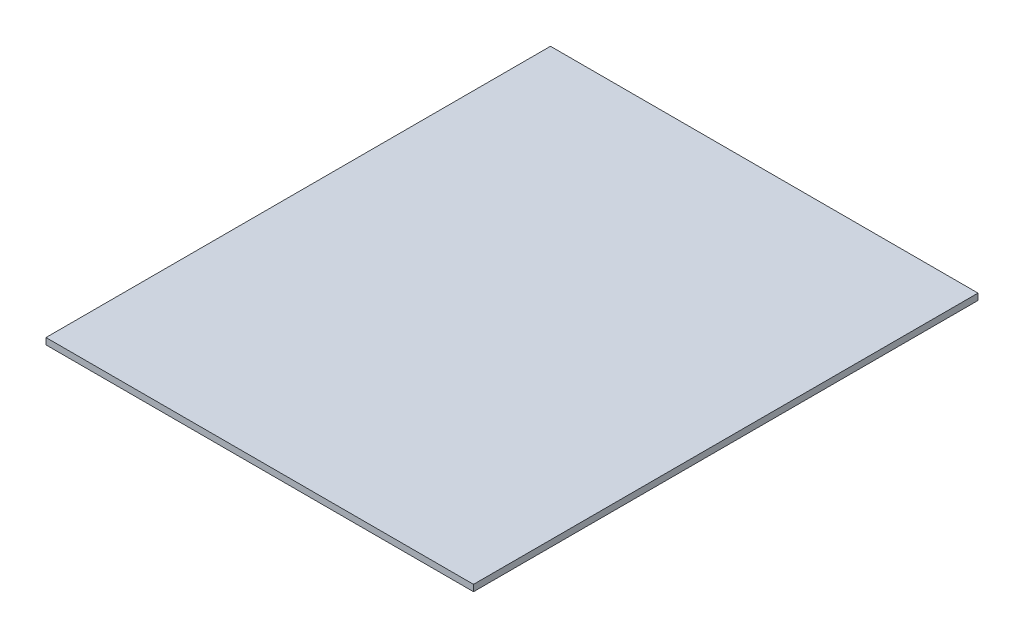
ISO-10303-21;
HEADER;
FILE_DESCRIPTION(('STEP AP214'),'2;1');
FILE_NAME('part.step','',(''),(''),'','','');
FILE_SCHEMA(('AUTOMOTIVE_DESIGN { 1 0 10303 214 1 1 1 1 }'));
ENDSEC;
DATA;
#1=APPLICATION_CONTEXT('core data for automotive mechanical design processes');
#2=APPLICATION_PROTOCOL_DEFINITION('international standard','automotive_design',2000,#1);
#3=PRODUCT_CONTEXT('',#1,'mechanical');
#4=PRODUCT('Part','Part','',(#3));
#5=PRODUCT_RELATED_PRODUCT_CATEGORY('part','',(#4));
#6=PRODUCT_DEFINITION_FORMATION('','',#4);
#7=PRODUCT_DEFINITION_CONTEXT('part definition',#1,'design');
#8=PRODUCT_DEFINITION('design','',#6,#7);
#9=PRODUCT_DEFINITION_SHAPE('','',#8);
#10=(LENGTH_UNIT() NAMED_UNIT(*) SI_UNIT(.MILLI.,.METRE.));
#11=(NAMED_UNIT(*) PLANE_ANGLE_UNIT() SI_UNIT($,.RADIAN.));
#12=(NAMED_UNIT(*) SI_UNIT($,.STERADIAN.) SOLID_ANGLE_UNIT());
#13=UNCERTAINTY_MEASURE_WITH_UNIT(LENGTH_MEASURE(1.E-05),#10,'distance_accuracy_value','');
#14=(GEOMETRIC_REPRESENTATION_CONTEXT(3) GLOBAL_UNCERTAINTY_ASSIGNED_CONTEXT((#13)) GLOBAL_UNIT_ASSIGNED_CONTEXT((#10,
#11,#12)) REPRESENTATION_CONTEXT('',''));
#15=CARTESIAN_POINT('',(0.,0.,0.));
#16=DIRECTION('',(0.,0.,1.));
#17=DIRECTION('',(1.,0.,0.));
#18=AXIS2_PLACEMENT_3D('',#15,#16,#17);
#19=CARTESIAN_POINT('',(0.,3.,0.));
#20=DIRECTION('',(1.,0.,0.));
#21=DIRECTION('',(0.,0.,-1.));
#22=AXIS2_PLACEMENT_3D('',#19,#20,#21);
#23=PLANE('',#22);
#24=DIRECTION('',(0.,0.,1.));
#25=VECTOR('',#24,1.);
#26=CARTESIAN_POINT('',(0.,0.,0.));
#27=LINE('',#26,#25);
#28=CARTESIAN_POINT('',(0.,0.,0.));
#29=VERTEX_POINT('',#28);
#30=CARTESIAN_POINT('',(0.,0.,236.));
#31=VERTEX_POINT('',#30);
#32=EDGE_CURVE('E119',#29,#31,#27,.T.);
#33=ORIENTED_EDGE('',*,*,#32,.T.);
#34=DIRECTION('',(0.,-1.,0.));
#35=VECTOR('',#34,1.);
#36=CARTESIAN_POINT('',(0.,3.,236.));
#37=LINE('',#36,#35);
#38=CARTESIAN_POINT('',(0.,3.,236.));
#39=VERTEX_POINT('',#38);
#40=EDGE_CURVE('E11',#39,#31,#37,.T.);
#41=ORIENTED_EDGE('',*,*,#40,.F.);
#42=DIRECTION('',(0.,0.,1.));
#43=VECTOR('',#42,1.);
#44=CARTESIAN_POINT('',(0.,3.,0.));
#45=LINE('',#44,#43);
#46=CARTESIAN_POINT('',(0.,3.,0.));
#47=VERTEX_POINT('',#46);
#48=EDGE_CURVE('E103',#47,#39,#45,.T.);
#49=ORIENTED_EDGE('',*,*,#48,.F.);
#50=DIRECTION('',(0.,-1.,0.));
#51=VECTOR('',#50,1.);
#52=CARTESIAN_POINT('',(0.,3.,0.));
#53=LINE('',#52,#51);
#54=EDGE_CURVE('E115',#47,#29,#53,.T.);
#55=ORIENTED_EDGE('',*,*,#54,.T.);
#56=EDGE_LOOP('',(#33,#41,#49,#55));
#57=FACE_BOUND('',#56,.T.);
#58=ADVANCED_FACE('F51',(#57),#23,.F.);
#59=CARTESIAN_POINT('',(0.,3.,236.));
#60=DIRECTION('',(0.,0.,-1.));
#61=DIRECTION('',(-1.,0.,0.));
#62=AXIS2_PLACEMENT_3D('',#59,#60,#61);
#63=PLANE('',#62);
#64=DIRECTION('',(1.,0.,0.));
#65=VECTOR('',#64,1.);
#66=CARTESIAN_POINT('',(0.,0.,236.));
#67=LINE('',#66,#65);
#68=CARTESIAN_POINT('',(200.,0.,236.));
#69=VERTEX_POINT('',#68);
#70=EDGE_CURVE('E108',#31,#69,#67,.T.);
#71=ORIENTED_EDGE('',*,*,#70,.T.);
#72=DIRECTION('',(0.,-1.,0.));
#73=VECTOR('',#72,1.);
#74=CARTESIAN_POINT('',(200.,3.,236.));
#75=LINE('',#74,#73);
#76=CARTESIAN_POINT('',(200.,3.,236.));
#77=VERTEX_POINT('',#76);
#78=EDGE_CURVE('E60',#77,#69,#75,.T.);
#79=ORIENTED_EDGE('',*,*,#78,.F.);
#80=DIRECTION('',(1.,0.,0.));
#81=VECTOR('',#80,1.);
#82=CARTESIAN_POINT('',(0.,3.,236.));
#83=LINE('',#82,#81);
#84=EDGE_CURVE('E98',#39,#77,#83,.T.);
#85=ORIENTED_EDGE('',*,*,#84,.F.);
#86=ORIENTED_EDGE('',*,*,#40,.T.);
#87=EDGE_LOOP('',(#71,#79,#85,#86));
#88=FACE_BOUND('',#87,.T.);
#89=ADVANCED_FACE('F107',(#88),#63,.F.);
#90=CARTESIAN_POINT('',(200.,3.,0.));
#91=DIRECTION('',(-1.,0.,0.));
#92=DIRECTION('',(0.,0.,1.));
#93=AXIS2_PLACEMENT_3D('',#90,#91,#92);
#94=PLANE('',#93);
#95=DIRECTION('',(0.,0.,-1.));
#96=VECTOR('',#95,1.);
#97=CARTESIAN_POINT('',(200.,0.,0.));
#98=LINE('',#97,#96);
#99=CARTESIAN_POINT('',(200.,0.,0.));
#100=VERTEX_POINT('',#99);
#101=EDGE_CURVE('E85',#69,#100,#98,.T.);
#102=ORIENTED_EDGE('',*,*,#101,.T.);
#103=DIRECTION('',(0.,-1.,0.));
#104=VECTOR('',#103,1.);
#105=CARTESIAN_POINT('',(200.,3.,0.));
#106=LINE('',#105,#104);
#107=CARTESIAN_POINT('',(200.,3.,0.));
#108=VERTEX_POINT('',#107);
#109=EDGE_CURVE('E110',#108,#100,#106,.T.);
#110=ORIENTED_EDGE('',*,*,#109,.F.);
#111=DIRECTION('',(0.,0.,-1.));
#112=VECTOR('',#111,1.);
#113=CARTESIAN_POINT('',(200.,3.,0.));
#114=LINE('',#113,#112);
#115=EDGE_CURVE('E101',#77,#108,#114,.T.);
#116=ORIENTED_EDGE('',*,*,#115,.F.);
#117=ORIENTED_EDGE('',*,*,#78,.T.);
#118=EDGE_LOOP('',(#102,#110,#116,#117));
#119=FACE_BOUND('',#118,.T.);
#120=ADVANCED_FACE('F111',(#119),#94,.F.);
#121=CARTESIAN_POINT('',(0.,3.,0.));
#122=DIRECTION('',(0.,0.,1.));
#123=DIRECTION('',(1.,0.,0.));
#124=AXIS2_PLACEMENT_3D('',#121,#122,#123);
#125=PLANE('',#124);
#126=DIRECTION('',(-1.,0.,0.));
#127=VECTOR('',#126,1.);
#128=CARTESIAN_POINT('',(0.,0.,0.));
#129=LINE('',#128,#127);
#130=EDGE_CURVE('E91',#100,#29,#129,.T.);
#131=ORIENTED_EDGE('',*,*,#130,.T.);
#132=ORIENTED_EDGE('',*,*,#54,.F.);
#133=DIRECTION('',(-1.,0.,0.));
#134=VECTOR('',#133,1.);
#135=CARTESIAN_POINT('',(0.,3.,0.));
#136=LINE('',#135,#134);
#137=EDGE_CURVE('E68',#108,#47,#136,.T.);
#138=ORIENTED_EDGE('',*,*,#137,.F.);
#139=ORIENTED_EDGE('',*,*,#109,.T.);
#140=EDGE_LOOP('',(#131,#132,#138,#139));
#141=FACE_BOUND('',#140,.T.);
#142=ADVANCED_FACE('F132',(#141),#125,.F.);
#143=CARTESIAN_POINT('',(0.,3.,0.));
#144=DIRECTION('',(0.,1.,0.));
#145=DIRECTION('',(0.,0.,1.));
#146=AXIS2_PLACEMENT_3D('',#143,#144,#145);
#147=PLANE('',#146);
#148=ORIENTED_EDGE('',*,*,#48,.T.);
#149=ORIENTED_EDGE('',*,*,#84,.T.);
#150=ORIENTED_EDGE('',*,*,#115,.T.);
#151=ORIENTED_EDGE('',*,*,#137,.T.);
#152=EDGE_LOOP('',(#148,#149,#150,#151));
#153=FACE_BOUND('',#152,.T.);
#154=ADVANCED_FACE('F99',(#153),#147,.T.);
#155=CARTESIAN_POINT('',(0.,0.,0.));
#156=DIRECTION('',(0.,1.,0.));
#157=DIRECTION('',(0.,0.,1.));
#158=AXIS2_PLACEMENT_3D('',#155,#156,#157);
#159=PLANE('',#158);
#160=ORIENTED_EDGE('',*,*,#32,.F.);
#161=ORIENTED_EDGE('',*,*,#130,.F.);
#162=ORIENTED_EDGE('',*,*,#101,.F.);
#163=ORIENTED_EDGE('',*,*,#70,.F.);
#164=EDGE_LOOP('',(#160,#161,#162,#163));
#165=FACE_BOUND('',#164,.T.);
#166=ADVANCED_FACE('F135',(#165),#159,.F.);
#167=CLOSED_SHELL('',(#58,#89,#120,#142,#154,#166));
#168=MANIFOLD_SOLID_BREP('B2',#167);
#169=ADVANCED_BREP_SHAPE_REPRESENTATION('',(#18,#168),#14);
#170=SHAPE_DEFINITION_REPRESENTATION(#9,#169);
ENDSEC;
END-ISO-10303-21;
